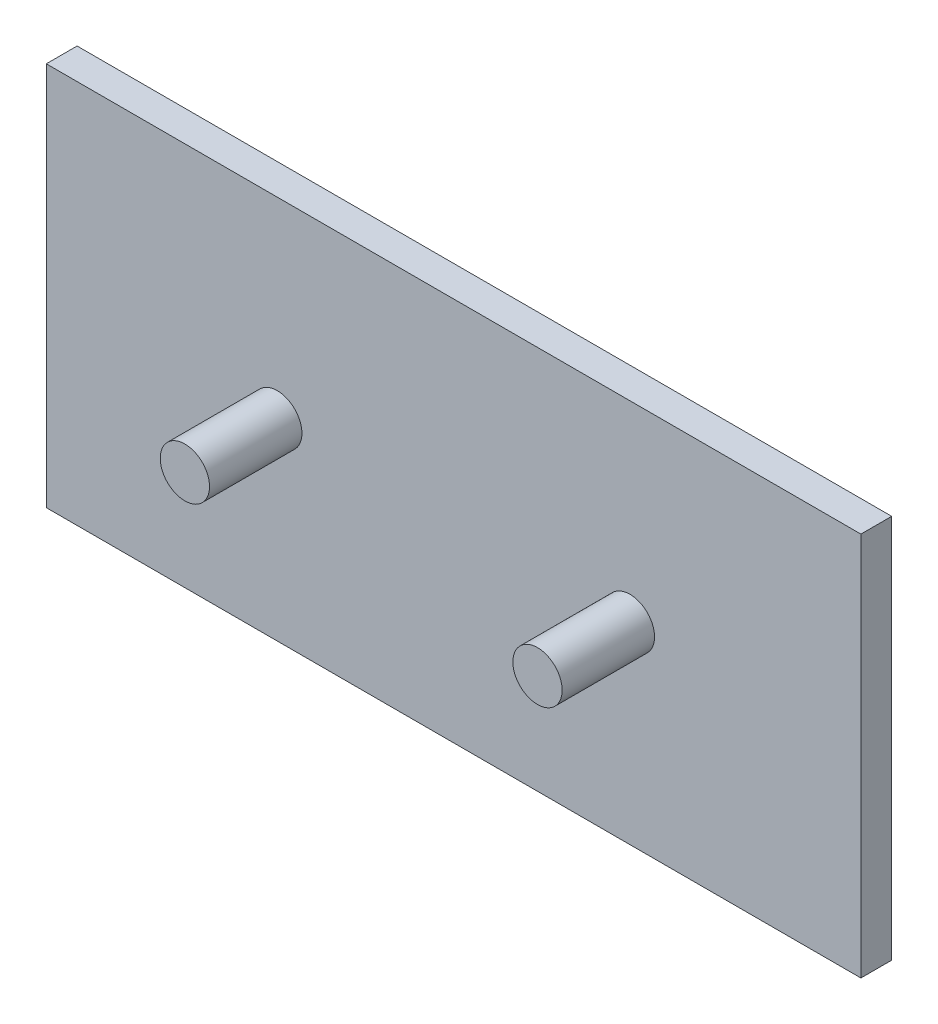
ISO-10303-21;
HEADER;
FILE_DESCRIPTION(('STEP AP214'),'2;1');
FILE_NAME('part.step','',(''),(''),'','','');
FILE_SCHEMA(('AUTOMOTIVE_DESIGN { 1 0 10303 214 1 1 1 1 }'));
ENDSEC;
DATA;
#1=APPLICATION_CONTEXT('core data for automotive mechanical design processes');
#2=APPLICATION_PROTOCOL_DEFINITION('international standard','automotive_design',2000,#1);
#3=PRODUCT_CONTEXT('',#1,'mechanical');
#4=PRODUCT('Part','Part','',(#3));
#5=PRODUCT_RELATED_PRODUCT_CATEGORY('part','',(#4));
#6=PRODUCT_DEFINITION_FORMATION('','',#4);
#7=PRODUCT_DEFINITION_CONTEXT('part definition',#1,'design');
#8=PRODUCT_DEFINITION('design','',#6,#7);
#9=PRODUCT_DEFINITION_SHAPE('','',#8);
#10=(LENGTH_UNIT() NAMED_UNIT(*) SI_UNIT(.MILLI.,.METRE.));
#11=(NAMED_UNIT(*) PLANE_ANGLE_UNIT() SI_UNIT($,.RADIAN.));
#12=(NAMED_UNIT(*) SI_UNIT($,.STERADIAN.) SOLID_ANGLE_UNIT());
#13=UNCERTAINTY_MEASURE_WITH_UNIT(LENGTH_MEASURE(1.E-05),#10,'distance_accuracy_value','');
#14=(GEOMETRIC_REPRESENTATION_CONTEXT(3) GLOBAL_UNCERTAINTY_ASSIGNED_CONTEXT((#13)) GLOBAL_UNIT_ASSIGNED_CONTEXT((#10,
#11,#12)) REPRESENTATION_CONTEXT('',''));
#15=CARTESIAN_POINT('',(0.,0.,0.));
#16=DIRECTION('',(0.,0.,1.));
#17=DIRECTION('',(1.,0.,0.));
#18=AXIS2_PLACEMENT_3D('',#15,#16,#17);
#19=CARTESIAN_POINT('',(-55.5276747790173,30.9250663992052,5.));
#20=DIRECTION('',(1.,0.,0.));
#21=DIRECTION('',(0.,0.,-1.));
#22=AXIS2_PLACEMENT_3D('',#19,#20,#21);
#23=PLANE('',#22);
#24=DIRECTION('',(0.,-1.,0.));
#25=VECTOR('',#24,1.);
#26=CARTESIAN_POINT('',(-55.5276747790173,30.9250663992052,0.));
#27=LINE('',#26,#25);
#28=CARTESIAN_POINT('',(-55.5276747790173,30.9250663992052,0.));
#29=VERTEX_POINT('',#28);
#30=CARTESIAN_POINT('',(-55.5276747790173,-31.4748453574133,0.));
#31=VERTEX_POINT('',#30);
#32=EDGE_CURVE('E107',#29,#31,#27,.T.);
#33=ORIENTED_EDGE('',*,*,#32,.T.);
#34=DIRECTION('',(0.,0.,-1.));
#35=VECTOR('',#34,1.);
#36=CARTESIAN_POINT('',(-55.5276747790173,-31.4748453574133,5.));
#37=LINE('',#36,#35);
#38=CARTESIAN_POINT('',(-55.5276747790173,-31.4748453574133,5.));
#39=VERTEX_POINT('',#38);
#40=EDGE_CURVE('E11',#39,#31,#37,.T.);
#41=ORIENTED_EDGE('',*,*,#40,.F.);
#42=DIRECTION('',(0.,-1.,0.));
#43=VECTOR('',#42,1.);
#44=CARTESIAN_POINT('',(-55.5276747790173,30.9250663992052,5.));
#45=LINE('',#44,#43);
#46=CARTESIAN_POINT('',(-55.5276747790173,30.9250663992052,5.));
#47=VERTEX_POINT('',#46);
#48=EDGE_CURVE('E91',#47,#39,#45,.T.);
#49=ORIENTED_EDGE('',*,*,#48,.F.);
#50=DIRECTION('',(0.,0.,-1.));
#51=VECTOR('',#50,1.);
#52=CARTESIAN_POINT('',(-55.5276747790173,30.9250663992052,5.));
#53=LINE('',#52,#51);
#54=EDGE_CURVE('E103',#47,#29,#53,.T.);
#55=ORIENTED_EDGE('',*,*,#54,.T.);
#56=EDGE_LOOP('',(#33,#41,#49,#55));
#57=FACE_BOUND('',#56,.T.);
#58=ADVANCED_FACE('F39',(#57),#23,.F.);
#59=CARTESIAN_POINT('',(-55.5276747790173,-31.4748453574133,5.));
#60=DIRECTION('',(0.,1.,0.));
#61=DIRECTION('',(0.,0.,1.));
#62=AXIS2_PLACEMENT_3D('',#59,#60,#61);
#63=PLANE('',#62);
#64=DIRECTION('',(1.,0.,0.));
#65=VECTOR('',#64,1.);
#66=CARTESIAN_POINT('',(-55.5276747790173,-31.4748453574133,0.));
#67=LINE('',#66,#65);
#68=CARTESIAN_POINT('',(76.6941646700289,-31.4748453574133,0.));
#69=VERTEX_POINT('',#68);
#70=EDGE_CURVE('E96',#31,#69,#67,.T.);
#71=ORIENTED_EDGE('',*,*,#70,.T.);
#72=DIRECTION('',(0.,0.,-1.));
#73=VECTOR('',#72,1.);
#74=CARTESIAN_POINT('',(76.6941646700289,-31.4748453574133,5.));
#75=LINE('',#74,#73);
#76=CARTESIAN_POINT('',(76.6941646700289,-31.4748453574133,5.));
#77=VERTEX_POINT('',#76);
#78=EDGE_CURVE('E48',#77,#69,#75,.T.);
#79=ORIENTED_EDGE('',*,*,#78,.F.);
#80=DIRECTION('',(1.,0.,0.));
#81=VECTOR('',#80,1.);
#82=CARTESIAN_POINT('',(-55.5276747790173,-31.4748453574133,5.));
#83=LINE('',#82,#81);
#84=EDGE_CURVE('E86',#39,#77,#83,.T.);
#85=ORIENTED_EDGE('',*,*,#84,.F.);
#86=ORIENTED_EDGE('',*,*,#40,.T.);
#87=EDGE_LOOP('',(#71,#79,#85,#86));
#88=FACE_BOUND('',#87,.T.);
#89=ADVANCED_FACE('F95',(#88),#63,.F.);
#90=CARTESIAN_POINT('',(76.6941646700289,30.9250663992052,5.));
#91=DIRECTION('',(-1.,0.,0.));
#92=DIRECTION('',(0.,0.,1.));
#93=AXIS2_PLACEMENT_3D('',#90,#91,#92);
#94=PLANE('',#93);
#95=DIRECTION('',(0.,1.,0.));
#96=VECTOR('',#95,1.);
#97=CARTESIAN_POINT('',(76.6941646700289,30.9250663992052,0.));
#98=LINE('',#97,#96);
#99=CARTESIAN_POINT('',(76.6941646700289,30.9250663992052,0.));
#100=VERTEX_POINT('',#99);
#101=EDGE_CURVE('E73',#69,#100,#98,.T.);
#102=ORIENTED_EDGE('',*,*,#101,.T.);
#103=DIRECTION('',(0.,0.,-1.));
#104=VECTOR('',#103,1.);
#105=CARTESIAN_POINT('',(76.6941646700289,30.9250663992052,5.));
#106=LINE('',#105,#104);
#107=CARTESIAN_POINT('',(76.6941646700289,30.9250663992052,5.));
#108=VERTEX_POINT('',#107);
#109=EDGE_CURVE('E98',#108,#100,#106,.T.);
#110=ORIENTED_EDGE('',*,*,#109,.F.);
#111=DIRECTION('',(0.,1.,0.));
#112=VECTOR('',#111,1.);
#113=CARTESIAN_POINT('',(76.6941646700289,30.9250663992052,5.));
#114=LINE('',#113,#112);
#115=EDGE_CURVE('E89',#77,#108,#114,.T.);
#116=ORIENTED_EDGE('',*,*,#115,.F.);
#117=ORIENTED_EDGE('',*,*,#78,.T.);
#118=EDGE_LOOP('',(#102,#110,#116,#117));
#119=FACE_BOUND('',#118,.T.);
#120=ADVANCED_FACE('F99',(#119),#94,.F.);
#121=CARTESIAN_POINT('',(-55.5276747790173,30.9250663992052,5.));
#122=DIRECTION('',(0.,-1.,0.));
#123=DIRECTION('',(0.,0.,-1.));
#124=AXIS2_PLACEMENT_3D('',#121,#122,#123);
#125=PLANE('',#124);
#126=DIRECTION('',(-1.,0.,0.));
#127=VECTOR('',#126,1.);
#128=CARTESIAN_POINT('',(-55.5276747790173,30.9250663992052,0.));
#129=LINE('',#128,#127);
#130=EDGE_CURVE('E79',#100,#29,#129,.T.);
#131=ORIENTED_EDGE('',*,*,#130,.T.);
#132=ORIENTED_EDGE('',*,*,#54,.F.);
#133=DIRECTION('',(-1.,0.,0.));
#134=VECTOR('',#133,1.);
#135=CARTESIAN_POINT('',(-55.5276747790173,30.9250663992052,5.));
#136=LINE('',#135,#134);
#137=EDGE_CURVE('E56',#108,#47,#136,.T.);
#138=ORIENTED_EDGE('',*,*,#137,.F.);
#139=ORIENTED_EDGE('',*,*,#109,.T.);
#140=EDGE_LOOP('',(#131,#132,#138,#139));
#141=FACE_BOUND('',#140,.T.);
#142=ADVANCED_FACE('F121',(#141),#125,.F.);
#143=CARTESIAN_POINT('',(0.,0.,5.));
#144=DIRECTION('',(0.,0.,1.));
#145=DIRECTION('',(1.,0.,0.));
#146=AXIS2_PLACEMENT_3D('',#143,#144,#145);
#147=PLANE('',#146);
#148=CARTESIAN_POINT('',(39.2024516953696,-0.274889479104048,5.));
#149=DIRECTION('',(0.,0.,1.));
#150=DIRECTION('',(-1.,0.,0.));
#151=AXIS2_PLACEMENT_3D('',#148,#149,#150);
#152=CIRCLE('',#151,4.);
#153=CARTESIAN_POINT('',(35.2024516953696,-0.274889479104048,5.));
#154=VERTEX_POINT('',#153);
#155=EDGE_CURVE('E136',#154,#154,#152,.T.);
#156=ORIENTED_EDGE('',*,*,#155,.F.);
#157=EDGE_LOOP('',(#156));
#158=FACE_BOUND('',#157,.T.);
#159=CARTESIAN_POINT('',(-18.0359618043581,-0.274889479104048,5.));
#160=DIRECTION('',(0.,0.,1.));
#161=DIRECTION('',(1.,0.,0.));
#162=AXIS2_PLACEMENT_3D('',#159,#160,#161);
#163=CIRCLE('',#162,4.);
#164=CARTESIAN_POINT('',(-14.0359618043581,-0.274889479104048,5.));
#165=VERTEX_POINT('',#164);
#166=EDGE_CURVE('E128',#165,#165,#163,.T.);
#167=ORIENTED_EDGE('',*,*,#166,.F.);
#168=EDGE_LOOP('',(#167));
#169=FACE_BOUND('',#168,.T.);
#170=ORIENTED_EDGE('',*,*,#48,.T.);
#171=ORIENTED_EDGE('',*,*,#84,.T.);
#172=ORIENTED_EDGE('',*,*,#115,.T.);
#173=ORIENTED_EDGE('',*,*,#137,.T.);
#174=EDGE_LOOP('',(#170,#171,#172,#173));
#175=FACE_BOUND('',#174,.T.);
#176=ADVANCED_FACE('F87',(#158,#169,#175),#147,.T.);
#177=CARTESIAN_POINT('',(0.,0.,0.));
#178=DIRECTION('',(0.,0.,1.));
#179=DIRECTION('',(1.,0.,0.));
#180=AXIS2_PLACEMENT_3D('',#177,#178,#179);
#181=PLANE('',#180);
#182=ORIENTED_EDGE('',*,*,#32,.F.);
#183=ORIENTED_EDGE('',*,*,#130,.F.);
#184=ORIENTED_EDGE('',*,*,#101,.F.);
#185=ORIENTED_EDGE('',*,*,#70,.F.);
#186=EDGE_LOOP('',(#182,#183,#184,#185));
#187=FACE_BOUND('',#186,.T.);
#188=ADVANCED_FACE('F124',(#187),#181,.F.);
#189=CARTESIAN_POINT('',(-18.0359618043581,-0.274889479104048,20.));
#190=DIRECTION('',(0.,0.,-1.));
#191=DIRECTION('',(-1.,0.,0.));
#192=AXIS2_PLACEMENT_3D('',#189,#190,#191);
#193=CYLINDRICAL_SURFACE('',#192,4.);
#194=CARTESIAN_POINT('',(-18.0359618043581,-0.274889479104048,20.));
#195=DIRECTION('',(0.,0.,1.));
#196=DIRECTION('',(1.,0.,0.));
#197=AXIS2_PLACEMENT_3D('',#194,#195,#196);
#198=CIRCLE('',#197,4.);
#199=CARTESIAN_POINT('',(-14.0359618043581,-0.274889479104048,20.));
#200=VERTEX_POINT('',#199);
#201=EDGE_CURVE('E111',#200,#200,#198,.T.);
#202=ORIENTED_EDGE('',*,*,#201,.F.);
#203=EDGE_LOOP('',(#202));
#204=FACE_BOUND('',#203,.T.);
#205=ORIENTED_EDGE('',*,*,#166,.T.);
#206=EDGE_LOOP('',(#205));
#207=FACE_BOUND('',#206,.T.);
#208=ADVANCED_FACE('F158',(#204,#207),#193,.T.);
#209=CARTESIAN_POINT('',(-18.0359618043581,-0.274889479104048,20.));
#210=DIRECTION('',(0.,0.,1.));
#211=DIRECTION('',(1.,0.,0.));
#212=AXIS2_PLACEMENT_3D('',#209,#210,#211);
#213=PLANE('',#212);
#214=ORIENTED_EDGE('',*,*,#201,.T.);
#215=EDGE_LOOP('',(#214));
#216=FACE_BOUND('',#215,.T.);
#217=ADVANCED_FACE('F149',(#216),#213,.T.);
#218=CARTESIAN_POINT('',(39.2024516953696,-0.274889479104048,20.));
#219=DIRECTION('',(0.,0.,-1.));
#220=DIRECTION('',(-1.,0.,0.));
#221=AXIS2_PLACEMENT_3D('',#218,#219,#220);
#222=CYLINDRICAL_SURFACE('',#221,4.);
#223=CARTESIAN_POINT('',(39.2024516953696,-0.274889479104048,20.));
#224=DIRECTION('',(0.,0.,1.));
#225=DIRECTION('',(-1.,0.,0.));
#226=AXIS2_PLACEMENT_3D('',#223,#224,#225);
#227=CIRCLE('',#226,4.);
#228=CARTESIAN_POINT('',(35.2024516953696,-0.274889479104048,20.));
#229=VERTEX_POINT('',#228);
#230=EDGE_CURVE('E132',#229,#229,#227,.T.);
#231=ORIENTED_EDGE('',*,*,#230,.F.);
#232=EDGE_LOOP('',(#231));
#233=FACE_BOUND('',#232,.T.);
#234=ORIENTED_EDGE('',*,*,#155,.T.);
#235=EDGE_LOOP('',(#234));
#236=FACE_BOUND('',#235,.T.);
#237=ADVANCED_FACE('F146',(#233,#236),#222,.T.);
#238=CARTESIAN_POINT('',(39.2024516953696,-0.274889479104048,20.));
#239=DIRECTION('',(0.,0.,-1.));
#240=DIRECTION('',(-1.,0.,0.));
#241=AXIS2_PLACEMENT_3D('',#238,#239,#240);
#242=PLANE('',#241);
#243=ORIENTED_EDGE('',*,*,#230,.T.);
#244=EDGE_LOOP('',(#243));
#245=FACE_BOUND('',#244,.T.);
#246=ADVANCED_FACE('F144',(#245),#242,.F.);
#247=CLOSED_SHELL('',(#58,#89,#120,#142,#176,#188,#208,#217,#237,#246));
#248=MANIFOLD_SOLID_BREP('B2',#247);
#249=ADVANCED_BREP_SHAPE_REPRESENTATION('',(#18,#248),#14);
#250=SHAPE_DEFINITION_REPRESENTATION(#9,#249);
ENDSEC;
END-ISO-10303-21;
